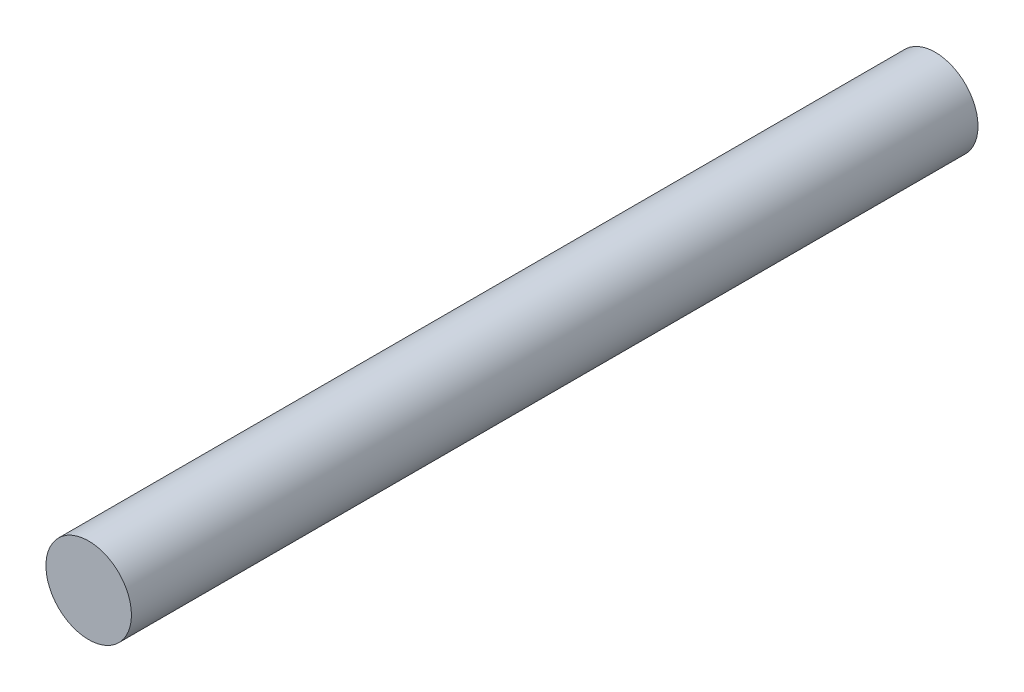
ISO-10303-21;
HEADER;
FILE_DESCRIPTION(('STEP AP214'),'2;1');
FILE_NAME('part.step','',(''),(''),'','','');
FILE_SCHEMA(('AUTOMOTIVE_DESIGN { 1 0 10303 214 1 1 1 1 }'));
ENDSEC;
DATA;
#1=APPLICATION_CONTEXT('core data for automotive mechanical design processes');
#2=APPLICATION_PROTOCOL_DEFINITION('international standard','automotive_design',2000,#1);
#3=PRODUCT_CONTEXT('',#1,'mechanical');
#4=PRODUCT('Part','Part','',(#3));
#5=PRODUCT_RELATED_PRODUCT_CATEGORY('part','',(#4));
#6=PRODUCT_DEFINITION_FORMATION('','',#4);
#7=PRODUCT_DEFINITION_CONTEXT('part definition',#1,'design');
#8=PRODUCT_DEFINITION('design','',#6,#7);
#9=PRODUCT_DEFINITION_SHAPE('','',#8);
#10=(LENGTH_UNIT() NAMED_UNIT(*) SI_UNIT(.MILLI.,.METRE.));
#11=(NAMED_UNIT(*) PLANE_ANGLE_UNIT() SI_UNIT($,.RADIAN.));
#12=(NAMED_UNIT(*) SI_UNIT($,.STERADIAN.) SOLID_ANGLE_UNIT());
#13=UNCERTAINTY_MEASURE_WITH_UNIT(LENGTH_MEASURE(1.E-05),#10,'distance_accuracy_value','');
#14=(GEOMETRIC_REPRESENTATION_CONTEXT(3) GLOBAL_UNCERTAINTY_ASSIGNED_CONTEXT((#13)) GLOBAL_UNIT_ASSIGNED_CONTEXT((#10,
#11,#12)) REPRESENTATION_CONTEXT('',''));
#15=CARTESIAN_POINT('',(0.,0.,0.));
#16=DIRECTION('',(0.,0.,1.));
#17=DIRECTION('',(1.,0.,0.));
#18=AXIS2_PLACEMENT_3D('',#15,#16,#17);
#19=CARTESIAN_POINT('',(0.,0.,99.));
#20=DIRECTION('',(0.,0.,-1.));
#21=DIRECTION('',(-1.,0.,0.));
#22=AXIS2_PLACEMENT_3D('',#19,#20,#21);
#23=CYLINDRICAL_SURFACE('',#22,5.);
#24=CARTESIAN_POINT('',(0.,0.,99.));
#25=DIRECTION('',(0.,0.,1.));
#26=DIRECTION('',(1.,0.,0.));
#27=AXIS2_PLACEMENT_3D('',#24,#25,#26);
#28=CIRCLE('',#27,5.);
#29=CARTESIAN_POINT('',(5.,0.,99.));
#30=VERTEX_POINT('',#29);
#31=EDGE_CURVE('E10',#30,#30,#28,.T.);
#32=ORIENTED_EDGE('',*,*,#31,.F.);
#33=EDGE_LOOP('',(#32));
#34=FACE_BOUND('',#33,.T.);
#35=CARTESIAN_POINT('',(0.,0.,0.));
#36=DIRECTION('',(0.,0.,1.));
#37=DIRECTION('',(1.,0.,0.));
#38=AXIS2_PLACEMENT_3D('',#35,#36,#37);
#39=CIRCLE('',#38,5.);
#40=CARTESIAN_POINT('',(5.,0.,0.));
#41=VERTEX_POINT('',#40);
#42=EDGE_CURVE('E44',#41,#41,#39,.T.);
#43=ORIENTED_EDGE('',*,*,#42,.T.);
#44=EDGE_LOOP('',(#43));
#45=FACE_BOUND('',#44,.T.);
#46=ADVANCED_FACE('F41',(#34,#45),#23,.T.);
#47=CARTESIAN_POINT('',(0.,0.,99.));
#48=DIRECTION('',(0.,0.,1.));
#49=DIRECTION('',(1.,0.,0.));
#50=AXIS2_PLACEMENT_3D('',#47,#48,#49);
#51=PLANE('',#50);
#52=ORIENTED_EDGE('',*,*,#31,.T.);
#53=EDGE_LOOP('',(#52));
#54=FACE_BOUND('',#53,.T.);
#55=ADVANCED_FACE('F56',(#54),#51,.T.);
#56=CARTESIAN_POINT('',(0.,0.,0.));
#57=DIRECTION('',(0.,0.,1.));
#58=DIRECTION('',(1.,0.,0.));
#59=AXIS2_PLACEMENT_3D('',#56,#57,#58);
#60=PLANE('',#59);
#61=ORIENTED_EDGE('',*,*,#42,.F.);
#62=EDGE_LOOP('',(#61));
#63=FACE_BOUND('',#62,.T.);
#64=ADVANCED_FACE('F54',(#63),#60,.F.);
#65=CLOSED_SHELL('',(#46,#55,#64));
#66=MANIFOLD_SOLID_BREP('B2',#65);
#67=ADVANCED_BREP_SHAPE_REPRESENTATION('',(#18,#66),#14);
#68=SHAPE_DEFINITION_REPRESENTATION(#9,#67);
ENDSEC;
END-ISO-10303-21;
